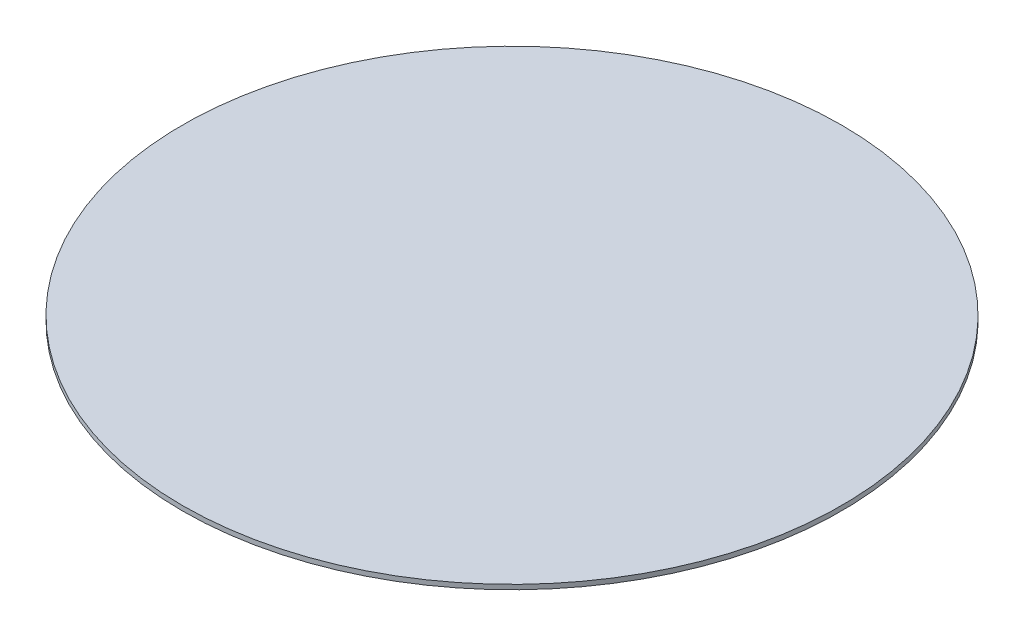
ISO-10303-21;
HEADER;
FILE_DESCRIPTION(('STEP AP214'),'2;1');
FILE_NAME('part.step','',(''),(''),'','','');
FILE_SCHEMA(('AUTOMOTIVE_DESIGN { 1 0 10303 214 1 1 1 1 }'));
ENDSEC;
DATA;
#1=APPLICATION_CONTEXT('core data for automotive mechanical design processes');
#2=APPLICATION_PROTOCOL_DEFINITION('international standard','automotive_design',2000,#1);
#3=PRODUCT_CONTEXT('',#1,'mechanical');
#4=PRODUCT('Part','Part','',(#3));
#5=PRODUCT_RELATED_PRODUCT_CATEGORY('part','',(#4));
#6=PRODUCT_DEFINITION_FORMATION('','',#4);
#7=PRODUCT_DEFINITION_CONTEXT('part definition',#1,'design');
#8=PRODUCT_DEFINITION('design','',#6,#7);
#9=PRODUCT_DEFINITION_SHAPE('','',#8);
#10=(LENGTH_UNIT() NAMED_UNIT(*) SI_UNIT(.MILLI.,.METRE.));
#11=(NAMED_UNIT(*) PLANE_ANGLE_UNIT() SI_UNIT($,.RADIAN.));
#12=(NAMED_UNIT(*) SI_UNIT($,.STERADIAN.) SOLID_ANGLE_UNIT());
#13=UNCERTAINTY_MEASURE_WITH_UNIT(LENGTH_MEASURE(1.E-05),#10,'distance_accuracy_value','');
#14=(GEOMETRIC_REPRESENTATION_CONTEXT(3) GLOBAL_UNCERTAINTY_ASSIGNED_CONTEXT((#13)) GLOBAL_UNIT_ASSIGNED_CONTEXT((#10,
#11,#12)) REPRESENTATION_CONTEXT('',''));
#15=CARTESIAN_POINT('',(0.,0.,0.));
#16=DIRECTION('',(0.,0.,1.));
#17=DIRECTION('',(1.,0.,0.));
#18=AXIS2_PLACEMENT_3D('',#15,#16,#17);
#19=CARTESIAN_POINT('',(0.,5.,0.));
#20=DIRECTION('',(0.,-1.,0.));
#21=DIRECTION('',(0.,0.,-1.));
#22=AXIS2_PLACEMENT_3D('',#19,#20,#21);
#23=CYLINDRICAL_SURFACE('',#22,350.);
#24=CARTESIAN_POINT('',(0.,5.,0.));
#25=DIRECTION('',(0.,1.,0.));
#26=DIRECTION('',(0.,0.,1.));
#27=AXIS2_PLACEMENT_3D('',#24,#25,#26);
#28=CIRCLE('',#27,350.);
#29=CARTESIAN_POINT('',(0.,5.,350.));
#30=VERTEX_POINT('',#29);
#31=EDGE_CURVE('E10',#30,#30,#28,.T.);
#32=ORIENTED_EDGE('',*,*,#31,.F.);
#33=EDGE_LOOP('',(#32));
#34=FACE_BOUND('',#33,.T.);
#35=CARTESIAN_POINT('',(0.,0.,0.));
#36=DIRECTION('',(0.,1.,0.));
#37=DIRECTION('',(0.,0.,1.));
#38=AXIS2_PLACEMENT_3D('',#35,#36,#37);
#39=CIRCLE('',#38,350.);
#40=CARTESIAN_POINT('',(0.,0.,350.));
#41=VERTEX_POINT('',#40);
#42=EDGE_CURVE('E34',#41,#41,#39,.T.);
#43=ORIENTED_EDGE('',*,*,#42,.T.);
#44=EDGE_LOOP('',(#43));
#45=FACE_BOUND('',#44,.T.);
#46=ADVANCED_FACE('F31',(#34,#45),#23,.T.);
#47=CARTESIAN_POINT('',(0.,5.,0.));
#48=DIRECTION('',(0.,1.,0.));
#49=DIRECTION('',(0.,0.,1.));
#50=AXIS2_PLACEMENT_3D('',#47,#48,#49);
#51=PLANE('',#50);
#52=ORIENTED_EDGE('',*,*,#31,.T.);
#53=EDGE_LOOP('',(#52));
#54=FACE_BOUND('',#53,.T.);
#55=ADVANCED_FACE('F46',(#54),#51,.T.);
#56=CARTESIAN_POINT('',(0.,0.,0.));
#57=DIRECTION('',(0.,1.,0.));
#58=DIRECTION('',(0.,0.,1.));
#59=AXIS2_PLACEMENT_3D('',#56,#57,#58);
#60=PLANE('',#59);
#61=ORIENTED_EDGE('',*,*,#42,.F.);
#62=EDGE_LOOP('',(#61));
#63=FACE_BOUND('',#62,.T.);
#64=ADVANCED_FACE('F44',(#63),#60,.F.);
#65=CLOSED_SHELL('',(#46,#55,#64));
#66=MANIFOLD_SOLID_BREP('B2',#65);
#67=ADVANCED_BREP_SHAPE_REPRESENTATION('',(#18,#66),#14);
#68=SHAPE_DEFINITION_REPRESENTATION(#9,#67);
ENDSEC;
END-ISO-10303-21;
